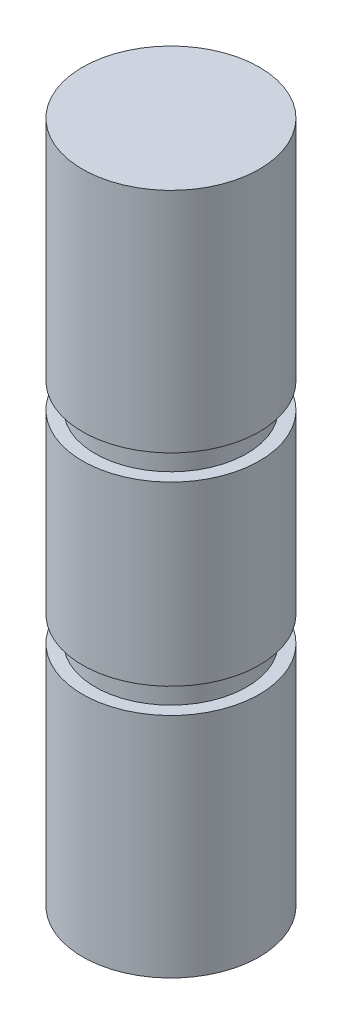
ISO-10303-21;
HEADER;
FILE_DESCRIPTION(('STEP AP214'),'2;1');
FILE_NAME('part.step','',(''),(''),'','','');
FILE_SCHEMA(('AUTOMOTIVE_DESIGN { 1 0 10303 214 1 1 1 1 }'));
ENDSEC;
DATA;
#1=APPLICATION_CONTEXT('core data for automotive mechanical design processes');
#2=APPLICATION_PROTOCOL_DEFINITION('international standard','automotive_design',2000,#1);
#3=PRODUCT_CONTEXT('',#1,'mechanical');
#4=PRODUCT('Part','Part','',(#3));
#5=PRODUCT_RELATED_PRODUCT_CATEGORY('part','',(#4));
#6=PRODUCT_DEFINITION_FORMATION('','',#4);
#7=PRODUCT_DEFINITION_CONTEXT('part definition',#1,'design');
#8=PRODUCT_DEFINITION('design','',#6,#7);
#9=PRODUCT_DEFINITION_SHAPE('','',#8);
#10=(LENGTH_UNIT() NAMED_UNIT(*) SI_UNIT(.MILLI.,.METRE.));
#11=(NAMED_UNIT(*) PLANE_ANGLE_UNIT() SI_UNIT($,.RADIAN.));
#12=(NAMED_UNIT(*) SI_UNIT($,.STERADIAN.) SOLID_ANGLE_UNIT());
#13=UNCERTAINTY_MEASURE_WITH_UNIT(LENGTH_MEASURE(1.E-05),#10,'distance_accuracy_value','');
#14=(GEOMETRIC_REPRESENTATION_CONTEXT(3) GLOBAL_UNCERTAINTY_ASSIGNED_CONTEXT((#13)) GLOBAL_UNIT_ASSIGNED_CONTEXT((#10,
#11,#12)) REPRESENTATION_CONTEXT('',''));
#15=CARTESIAN_POINT('',(0.,0.,0.));
#16=DIRECTION('',(0.,0.,1.));
#17=DIRECTION('',(1.,0.,0.));
#18=AXIS2_PLACEMENT_3D('',#15,#16,#17);
#19=CARTESIAN_POINT('',(0.,13.5,0.));
#20=DIRECTION('',(0.,1.,0.));
#21=DIRECTION('',(0.,0.,1.));
#22=AXIS2_PLACEMENT_3D('',#19,#20,#21);
#23=PLANE('',#22);
#24=CARTESIAN_POINT('',(0.,13.5,0.));
#25=DIRECTION('',(0.,-1.,0.));
#26=DIRECTION('',(0.,0.,-1.));
#27=AXIS2_PLACEMENT_3D('',#24,#25,#26);
#28=CIRCLE('',#27,3.5);
#29=CARTESIAN_POINT('',(0.,13.5,-3.5));
#30=VERTEX_POINT('',#29);
#31=EDGE_CURVE('E10',#30,#30,#28,.T.);
#32=ORIENTED_EDGE('',*,*,#31,.F.);
#33=EDGE_LOOP('',(#32));
#34=FACE_BOUND('',#33,.T.);
#35=ADVANCED_FACE('F39',(#34),#23,.T.);
#36=CARTESIAN_POINT('',(0.,-13.5,0.));
#37=DIRECTION('',(0.,-1.,0.));
#38=DIRECTION('',(0.,0.,-1.));
#39=AXIS2_PLACEMENT_3D('',#36,#37,#38);
#40=CYLINDRICAL_SURFACE('',#39,3.5);
#41=ORIENTED_EDGE('',*,*,#31,.T.);
#42=EDGE_LOOP('',(#41));
#43=FACE_BOUND('',#42,.T.);
#44=CARTESIAN_POINT('',(0.,4.5,0.));
#45=DIRECTION('',(0.,-1.,0.));
#46=DIRECTION('',(0.,0.,-1.));
#47=AXIS2_PLACEMENT_3D('',#44,#45,#46);
#48=CIRCLE('',#47,3.5);
#49=CARTESIAN_POINT('',(0.,4.5,-3.5));
#50=VERTEX_POINT('',#49);
#51=EDGE_CURVE('E46',#50,#50,#48,.T.);
#52=ORIENTED_EDGE('',*,*,#51,.F.);
#53=EDGE_LOOP('',(#52));
#54=FACE_BOUND('',#53,.T.);
#55=ADVANCED_FACE('F103',(#43,#54),#40,.T.);
#56=CARTESIAN_POINT('',(0.,4.5,-3.5));
#57=DIRECTION('',(0.,-1.,0.));
#58=DIRECTION('',(0.,0.,-1.));
#59=AXIS2_PLACEMENT_3D('',#56,#57,#58);
#60=PLANE('',#59);
#61=ORIENTED_EDGE('',*,*,#51,.T.);
#62=EDGE_LOOP('',(#61));
#63=FACE_BOUND('',#62,.T.);
#64=CARTESIAN_POINT('',(0.,4.5,0.));
#65=DIRECTION('',(0.,-1.,0.));
#66=DIRECTION('',(0.,0.,-1.));
#67=AXIS2_PLACEMENT_3D('',#64,#65,#66);
#68=CIRCLE('',#67,3.);
#69=CARTESIAN_POINT('',(0.,4.5,-3.));
#70=VERTEX_POINT('',#69);
#71=EDGE_CURVE('E53',#70,#70,#68,.T.);
#72=ORIENTED_EDGE('',*,*,#71,.F.);
#73=EDGE_LOOP('',(#72));
#74=FACE_BOUND('',#73,.T.);
#75=ADVANCED_FACE('F108',(#63,#74),#60,.T.);
#76=CARTESIAN_POINT('',(0.,-13.5,0.));
#77=DIRECTION('',(0.,-1.,0.));
#78=DIRECTION('',(0.,0.,-1.));
#79=AXIS2_PLACEMENT_3D('',#76,#77,#78);
#80=CYLINDRICAL_SURFACE('',#79,3.);
#81=ORIENTED_EDGE('',*,*,#71,.T.);
#82=EDGE_LOOP('',(#81));
#83=FACE_BOUND('',#82,.T.);
#84=CARTESIAN_POINT('',(0.,3.5,0.));
#85=DIRECTION('',(0.,-1.,0.));
#86=DIRECTION('',(0.,0.,-1.));
#87=AXIS2_PLACEMENT_3D('',#84,#85,#86);
#88=CIRCLE('',#87,3.);
#89=CARTESIAN_POINT('',(0.,3.5,-3.));
#90=VERTEX_POINT('',#89);
#91=EDGE_CURVE('E58',#90,#90,#88,.T.);
#92=ORIENTED_EDGE('',*,*,#91,.F.);
#93=EDGE_LOOP('',(#92));
#94=FACE_BOUND('',#93,.T.);
#95=ADVANCED_FACE('F112',(#83,#94),#80,.T.);
#96=CARTESIAN_POINT('',(0.,3.5,-3.));
#97=DIRECTION('',(0.,1.,0.));
#98=DIRECTION('',(0.,0.,1.));
#99=AXIS2_PLACEMENT_3D('',#96,#97,#98);
#100=PLANE('',#99);
#101=ORIENTED_EDGE('',*,*,#91,.T.);
#102=EDGE_LOOP('',(#101));
#103=FACE_BOUND('',#102,.T.);
#104=CARTESIAN_POINT('',(0.,3.5,0.));
#105=DIRECTION('',(0.,-1.,0.));
#106=DIRECTION('',(0.,0.,-1.));
#107=AXIS2_PLACEMENT_3D('',#104,#105,#106);
#108=CIRCLE('',#107,3.5);
#109=CARTESIAN_POINT('',(0.,3.5,-3.5));
#110=VERTEX_POINT('',#109);
#111=EDGE_CURVE('E63',#110,#110,#108,.T.);
#112=ORIENTED_EDGE('',*,*,#111,.F.);
#113=EDGE_LOOP('',(#112));
#114=FACE_BOUND('',#113,.T.);
#115=ADVANCED_FACE('F118',(#103,#114),#100,.T.);
#116=CARTESIAN_POINT('',(0.,-13.5,0.));
#117=DIRECTION('',(0.,-1.,0.));
#118=DIRECTION('',(0.,0.,-1.));
#119=AXIS2_PLACEMENT_3D('',#116,#117,#118);
#120=CYLINDRICAL_SURFACE('',#119,3.5);
#121=ORIENTED_EDGE('',*,*,#111,.T.);
#122=EDGE_LOOP('',(#121));
#123=FACE_BOUND('',#122,.T.);
#124=CARTESIAN_POINT('',(0.,-3.5,0.));
#125=DIRECTION('',(0.,-1.,0.));
#126=DIRECTION('',(0.,0.,-1.));
#127=AXIS2_PLACEMENT_3D('',#124,#125,#126);
#128=CIRCLE('',#127,3.5);
#129=CARTESIAN_POINT('',(0.,-3.5,-3.5));
#130=VERTEX_POINT('',#129);
#131=EDGE_CURVE('E67',#130,#130,#128,.T.);
#132=ORIENTED_EDGE('',*,*,#131,.F.);
#133=EDGE_LOOP('',(#132));
#134=FACE_BOUND('',#133,.T.);
#135=ADVANCED_FACE('F122',(#123,#134),#120,.T.);
#136=CARTESIAN_POINT('',(0.,-3.5,-3.5));
#137=DIRECTION('',(0.,-1.,0.));
#138=DIRECTION('',(0.,0.,-1.));
#139=AXIS2_PLACEMENT_3D('',#136,#137,#138);
#140=PLANE('',#139);
#141=ORIENTED_EDGE('',*,*,#131,.T.);
#142=EDGE_LOOP('',(#141));
#143=FACE_BOUND('',#142,.T.);
#144=CARTESIAN_POINT('',(0.,-3.5,0.));
#145=DIRECTION('',(0.,-1.,0.));
#146=DIRECTION('',(0.,0.,-1.));
#147=AXIS2_PLACEMENT_3D('',#144,#145,#146);
#148=CIRCLE('',#147,3.);
#149=CARTESIAN_POINT('',(0.,-3.5,-3.));
#150=VERTEX_POINT('',#149);
#151=EDGE_CURVE('E70',#150,#150,#148,.T.);
#152=ORIENTED_EDGE('',*,*,#151,.F.);
#153=EDGE_LOOP('',(#152));
#154=FACE_BOUND('',#153,.T.);
#155=ADVANCED_FACE('F126',(#143,#154),#140,.T.);
#156=CARTESIAN_POINT('',(0.,-13.5,0.));
#157=DIRECTION('',(0.,-1.,0.));
#158=DIRECTION('',(0.,0.,-1.));
#159=AXIS2_PLACEMENT_3D('',#156,#157,#158);
#160=CYLINDRICAL_SURFACE('',#159,3.);
#161=ORIENTED_EDGE('',*,*,#151,.T.);
#162=EDGE_LOOP('',(#161));
#163=FACE_BOUND('',#162,.T.);
#164=CARTESIAN_POINT('',(0.,-4.5,0.));
#165=DIRECTION('',(0.,-1.,0.));
#166=DIRECTION('',(0.,0.,-1.));
#167=AXIS2_PLACEMENT_3D('',#164,#165,#166);
#168=CIRCLE('',#167,3.);
#169=CARTESIAN_POINT('',(0.,-4.5,-3.));
#170=VERTEX_POINT('',#169);
#171=EDGE_CURVE('E74',#170,#170,#168,.T.);
#172=ORIENTED_EDGE('',*,*,#171,.F.);
#173=EDGE_LOOP('',(#172));
#174=FACE_BOUND('',#173,.T.);
#175=ADVANCED_FACE('F99',(#163,#174),#160,.T.);
#176=CARTESIAN_POINT('',(0.,-4.5,-3.));
#177=DIRECTION('',(0.,1.,0.));
#178=DIRECTION('',(0.,0.,1.));
#179=AXIS2_PLACEMENT_3D('',#176,#177,#178);
#180=PLANE('',#179);
#181=ORIENTED_EDGE('',*,*,#171,.T.);
#182=EDGE_LOOP('',(#181));
#183=FACE_BOUND('',#182,.T.);
#184=CARTESIAN_POINT('',(0.,-4.5,0.));
#185=DIRECTION('',(0.,-1.,0.));
#186=DIRECTION('',(0.,0.,-1.));
#187=AXIS2_PLACEMENT_3D('',#184,#185,#186);
#188=CIRCLE('',#187,3.5);
#189=CARTESIAN_POINT('',(0.,-4.5,-3.5));
#190=VERTEX_POINT('',#189);
#191=EDGE_CURVE('E78',#190,#190,#188,.T.);
#192=ORIENTED_EDGE('',*,*,#191,.F.);
#193=EDGE_LOOP('',(#192));
#194=FACE_BOUND('',#193,.T.);
#195=ADVANCED_FACE('F91',(#183,#194),#180,.T.);
#196=CARTESIAN_POINT('',(0.,-13.5,0.));
#197=DIRECTION('',(0.,-1.,0.));
#198=DIRECTION('',(0.,0.,-1.));
#199=AXIS2_PLACEMENT_3D('',#196,#197,#198);
#200=CYLINDRICAL_SURFACE('',#199,3.5);
#201=ORIENTED_EDGE('',*,*,#191,.T.);
#202=EDGE_LOOP('',(#201));
#203=FACE_BOUND('',#202,.T.);
#204=CARTESIAN_POINT('',(0.,-13.5,0.));
#205=DIRECTION('',(0.,-1.,0.));
#206=DIRECTION('',(0.,0.,-1.));
#207=AXIS2_PLACEMENT_3D('',#204,#205,#206);
#208=CIRCLE('',#207,3.5);
#209=CARTESIAN_POINT('',(0.,-13.5,-3.5));
#210=VERTEX_POINT('',#209);
#211=EDGE_CURVE('E82',#210,#210,#208,.T.);
#212=ORIENTED_EDGE('',*,*,#211,.F.);
#213=EDGE_LOOP('',(#212));
#214=FACE_BOUND('',#213,.T.);
#215=ADVANCED_FACE('F89',(#203,#214),#200,.T.);
#216=CARTESIAN_POINT('',(0.,-13.5,-3.5));
#217=DIRECTION('',(0.,-1.,0.));
#218=DIRECTION('',(0.,0.,-1.));
#219=AXIS2_PLACEMENT_3D('',#216,#217,#218);
#220=PLANE('',#219);
#221=ORIENTED_EDGE('',*,*,#211,.T.);
#222=EDGE_LOOP('',(#221));
#223=FACE_BOUND('',#222,.T.);
#224=ADVANCED_FACE('F87',(#223),#220,.T.);
#225=CLOSED_SHELL('',(#35,#55,#75,#95,#115,#135,#155,#175,#195,#215,#224));
#226=MANIFOLD_SOLID_BREP('B2',#225);
#227=ADVANCED_BREP_SHAPE_REPRESENTATION('',(#18,#226),#14);
#228=SHAPE_DEFINITION_REPRESENTATION(#9,#227);
ENDSEC;
END-ISO-10303-21;
